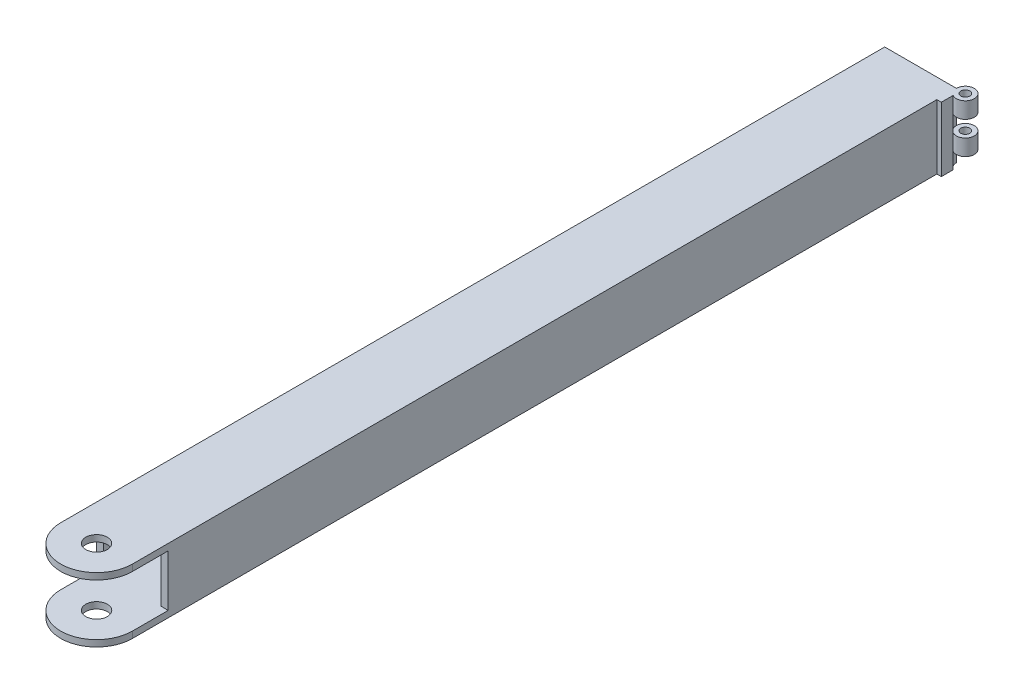
ISO-10303-21;
HEADER;
FILE_DESCRIPTION(('STEP AP214'),'2;1');
FILE_NAME('part.step','',(''),(''),'','','');
FILE_SCHEMA(('AUTOMOTIVE_DESIGN { 1 0 10303 214 1 1 1 1 }'));
ENDSEC;
DATA;
#1=APPLICATION_CONTEXT('core data for automotive mechanical design processes');
#2=APPLICATION_PROTOCOL_DEFINITION('international standard','automotive_design',2000,#1);
#3=PRODUCT_CONTEXT('',#1,'mechanical');
#4=PRODUCT('Part','Part','',(#3));
#5=PRODUCT_RELATED_PRODUCT_CATEGORY('part','',(#4));
#6=PRODUCT_DEFINITION_FORMATION('','',#4);
#7=PRODUCT_DEFINITION_CONTEXT('part definition',#1,'design');
#8=PRODUCT_DEFINITION('design','',#6,#7);
#9=PRODUCT_DEFINITION_SHAPE('','',#8);
#10=(LENGTH_UNIT() NAMED_UNIT(*) SI_UNIT(.MILLI.,.METRE.));
#11=(NAMED_UNIT(*) PLANE_ANGLE_UNIT() SI_UNIT($,.RADIAN.));
#12=(NAMED_UNIT(*) SI_UNIT($,.STERADIAN.) SOLID_ANGLE_UNIT());
#13=UNCERTAINTY_MEASURE_WITH_UNIT(LENGTH_MEASURE(1.E-05),#10,'distance_accuracy_value','');
#14=(GEOMETRIC_REPRESENTATION_CONTEXT(3) GLOBAL_UNCERTAINTY_ASSIGNED_CONTEXT((#13)) GLOBAL_UNIT_ASSIGNED_CONTEXT((#10,
#11,#12)) REPRESENTATION_CONTEXT('',''));
#15=CARTESIAN_POINT('',(0.,0.,0.));
#16=DIRECTION('',(0.,0.,1.));
#17=DIRECTION('',(1.,0.,0.));
#18=AXIS2_PLACEMENT_3D('',#15,#16,#17);
#19=CARTESIAN_POINT('',(25.,18.,0.));
#20=DIRECTION('',(0.,-1.,0.));
#21=DIRECTION('',(0.,0.,-1.));
#22=AXIS2_PLACEMENT_3D('',#19,#20,#21);
#23=CYLINDRICAL_SURFACE('',#22,5.);
#24=DIRECTION('',(0.,1.,0.));
#25=VECTOR('',#24,1.);
#26=CARTESIAN_POINT('',(20.,18.,0.));
#27=LINE('',#26,#25);
#28=CARTESIAN_POINT('',(20.,-9.,0.));
#29=VERTEX_POINT('',#28);
#30=CARTESIAN_POINT('',(20.,0.,0.));
#31=VERTEX_POINT('',#30);
#32=EDGE_CURVE('E209',#29,#31,#27,.T.);
#33=ORIENTED_EDGE('',*,*,#32,.T.);
#34=CARTESIAN_POINT('',(25.,0.,0.));
#35=DIRECTION('',(0.,1.,0.));
#36=DIRECTION('',(0.,0.,1.));
#37=AXIS2_PLACEMENT_3D('',#34,#35,#36);
#38=CIRCLE('',#37,5.);
#39=CARTESIAN_POINT('',(22.5,0.,4.3301270189222));
#40=VERTEX_POINT('',#39);
#41=EDGE_CURVE('E191',#40,#31,#38,.T.);
#42=ORIENTED_EDGE('',*,*,#41,.F.);
#43=DIRECTION('',(0.,-1.,0.));
#44=VECTOR('',#43,1.);
#45=CARTESIAN_POINT('',(22.5,18.,4.33012701892219));
#46=LINE('',#45,#44);
#47=CARTESIAN_POINT('',(22.5,-9.,4.33012701892219));
#48=VERTEX_POINT('',#47);
#49=EDGE_CURVE('E70',#40,#48,#46,.T.);
#50=ORIENTED_EDGE('',*,*,#49,.T.);
#51=CARTESIAN_POINT('',(25.,-9.,0.));
#52=DIRECTION('',(0.,-1.,0.));
#53=DIRECTION('',(0.,0.,-1.));
#54=AXIS2_PLACEMENT_3D('',#51,#52,#53);
#55=CIRCLE('',#54,5.);
#56=EDGE_CURVE('E181',#29,#48,#55,.T.);
#57=ORIENTED_EDGE('',*,*,#56,.F.);
#58=EDGE_LOOP('',(#33,#42,#50,#57));
#59=FACE_BOUND('',#58,.T.);
#60=ADVANCED_FACE('F43',(#59),#23,.T.);
#61=CARTESIAN_POINT('',(25.,18.,0.));
#62=DIRECTION('',(0.,-1.,0.));
#63=DIRECTION('',(0.,0.,-1.));
#64=AXIS2_PLACEMENT_3D('',#61,#62,#63);
#65=CYLINDRICAL_SURFACE('',#64,2.5);
#66=CARTESIAN_POINT('',(25.,-9.,0.));
#67=DIRECTION('',(0.,-1.,0.));
#68=DIRECTION('',(0.,0.,-1.));
#69=AXIS2_PLACEMENT_3D('',#66,#67,#68);
#70=CIRCLE('',#69,2.5);
#71=CARTESIAN_POINT('',(25.,-9.,-2.5));
#72=VERTEX_POINT('',#71);
#73=EDGE_CURVE('E48',#72,#72,#70,.F.);
#74=ORIENTED_EDGE('',*,*,#73,.F.);
#75=EDGE_LOOP('',(#74));
#76=FACE_BOUND('',#75,.T.);
#77=CARTESIAN_POINT('',(25.,0.,0.));
#78=DIRECTION('',(0.,1.,0.));
#79=DIRECTION('',(0.,0.,1.));
#80=AXIS2_PLACEMENT_3D('',#77,#78,#79);
#81=CIRCLE('',#80,2.5);
#82=CARTESIAN_POINT('',(25.,0.,2.5));
#83=VERTEX_POINT('',#82);
#84=EDGE_CURVE('E182',#83,#83,#81,.F.);
#85=ORIENTED_EDGE('',*,*,#84,.F.);
#86=EDGE_LOOP('',(#85));
#87=FACE_BOUND('',#86,.T.);
#88=ADVANCED_FACE('F480',(#76,#87),#65,.F.);
#89=CARTESIAN_POINT('',(-20.,-18.,480.));
#90=DIRECTION('',(0.,1.,0.));
#91=DIRECTION('',(0.,0.,1.));
#92=AXIS2_PLACEMENT_3D('',#89,#90,#91);
#93=PLANE('',#92);
#94=CARTESIAN_POINT('',(0.,-18.,460.));
#95=DIRECTION('',(0.,1.,0.));
#96=DIRECTION('',(0.,0.,1.));
#97=AXIS2_PLACEMENT_3D('',#94,#95,#96);
#98=CIRCLE('',#97,6.00000000000001);
#99=CARTESIAN_POINT('',(0.,-18.,466.));
#100=VERTEX_POINT('',#99);
#101=EDGE_CURVE('E273',#100,#100,#98,.T.);
#102=ORIENTED_EDGE('',*,*,#101,.T.);
#103=EDGE_LOOP('',(#102));
#104=FACE_BOUND('',#103,.T.);
#105=CARTESIAN_POINT('',(25.,-18.,0.));
#106=DIRECTION('',(0.,-1.,0.));
#107=DIRECTION('',(0.,0.,-1.));
#108=AXIS2_PLACEMENT_3D('',#105,#106,#107);
#109=CIRCLE('',#108,5.);
#110=CARTESIAN_POINT('',(22.5,-18.,4.33012701892219));
#111=VERTEX_POINT('',#110);
#112=CARTESIAN_POINT('',(20.,-18.,0.));
#113=VERTEX_POINT('',#112);
#114=EDGE_CURVE('E446',#111,#113,#109,.T.);
#115=ORIENTED_EDGE('',*,*,#114,.F.);
#116=DIRECTION('',(0.,0.,1.));
#117=VECTOR('',#116,1.);
#118=CARTESIAN_POINT('',(22.5,-18.,10.8981294611448));
#119=LINE('',#118,#117);
#120=CARTESIAN_POINT('',(22.5,-18.,10.8981294611448));
#121=VERTEX_POINT('',#120);
#122=EDGE_CURVE('E411',#111,#121,#119,.T.);
#123=ORIENTED_EDGE('',*,*,#122,.T.);
#124=DIRECTION('',(-1.,0.,0.));
#125=VECTOR('',#124,1.);
#126=CARTESIAN_POINT('',(20.,-18.,10.8981294611448));
#127=LINE('',#126,#125);
#128=CARTESIAN_POINT('',(20.,-18.,10.8981294611448));
#129=VERTEX_POINT('',#128);
#130=EDGE_CURVE('E409',#121,#129,#127,.T.);
#131=ORIENTED_EDGE('',*,*,#130,.T.);
#132=DIRECTION('',(0.,0.,-1.));
#133=VECTOR('',#132,1.);
#134=CARTESIAN_POINT('',(20.,-18.,480.));
#135=LINE('',#134,#133);
#136=CARTESIAN_POINT('',(20.,-18.,460.));
#137=VERTEX_POINT('',#136);
#138=EDGE_CURVE('E233',#137,#129,#135,.T.);
#139=ORIENTED_EDGE('',*,*,#138,.F.);
#140=CARTESIAN_POINT('',(0.,-18.,460.));
#141=DIRECTION('',(0.,1.,0.));
#142=DIRECTION('',(0.,0.,1.));
#143=AXIS2_PLACEMENT_3D('',#140,#141,#142);
#144=CIRCLE('',#143,20.);
#145=CARTESIAN_POINT('',(-20.,-18.,460.));
#146=VERTEX_POINT('',#145);
#147=EDGE_CURVE('E254',#137,#146,#144,.F.);
#148=ORIENTED_EDGE('',*,*,#147,.T.);
#149=DIRECTION('',(0.,0.,-1.));
#150=VECTOR('',#149,1.);
#151=CARTESIAN_POINT('',(-20.,-18.,480.));
#152=LINE('',#151,#150);
#153=CARTESIAN_POINT('',(-20.,-18.,0.));
#154=VERTEX_POINT('',#153);
#155=EDGE_CURVE('E236',#146,#154,#152,.T.);
#156=ORIENTED_EDGE('',*,*,#155,.T.);
#157=DIRECTION('',(1.,0.,0.));
#158=VECTOR('',#157,1.);
#159=CARTESIAN_POINT('',(-20.,-18.,0.));
#160=LINE('',#159,#158);
#161=EDGE_CURVE('E227',#154,#113,#160,.T.);
#162=ORIENTED_EDGE('',*,*,#161,.T.);
#163=EDGE_LOOP('',(#115,#123,#131,#139,#148,#156,#162));
#164=FACE_BOUND('',#163,.T.);
#165=ADVANCED_FACE('F406',(#104,#164),#93,.F.);
#166=CARTESIAN_POINT('',(25.,9.,0.));
#167=DIRECTION('',(0.,1.,0.));
#168=DIRECTION('',(0.,0.,1.));
#169=AXIS2_PLACEMENT_3D('',#166,#167,#168);
#170=CIRCLE('',#169,5.);
#171=CARTESIAN_POINT('',(22.5,9.,4.33012701892219));
#172=VERTEX_POINT('',#171);
#173=CARTESIAN_POINT('',(20.,9.,0.));
#174=VERTEX_POINT('',#173);
#175=EDGE_CURVE('E188',#172,#174,#170,.T.);
#176=ORIENTED_EDGE('',*,*,#175,.T.);
#177=CARTESIAN_POINT('',(20.,18.,0.));
#178=VERTEX_POINT('',#177);
#179=EDGE_CURVE('E197',#174,#178,#27,.T.);
#180=ORIENTED_EDGE('',*,*,#179,.T.);
#181=CARTESIAN_POINT('',(25.,18.,0.));
#182=DIRECTION('',(0.,-1.,0.));
#183=DIRECTION('',(0.,0.,-1.));
#184=AXIS2_PLACEMENT_3D('',#181,#182,#183);
#185=CIRCLE('',#184,5.);
#186=CARTESIAN_POINT('',(22.5,18.,4.33012701892219));
#187=VERTEX_POINT('',#186);
#188=EDGE_CURVE('E414',#178,#187,#185,.T.);
#189=ORIENTED_EDGE('',*,*,#188,.T.);
#190=EDGE_CURVE('E199',#187,#172,#46,.T.);
#191=ORIENTED_EDGE('',*,*,#190,.T.);
#192=EDGE_LOOP('',(#176,#180,#189,#191));
#193=FACE_BOUND('',#192,.T.);
#194=ADVANCED_FACE('F195',(#193),#23,.T.);
#195=CARTESIAN_POINT('',(25.,9.,0.));
#196=DIRECTION('',(0.,1.,0.));
#197=DIRECTION('',(0.,0.,1.));
#198=AXIS2_PLACEMENT_3D('',#195,#196,#197);
#199=CIRCLE('',#198,2.5);
#200=CARTESIAN_POINT('',(25.,9.,2.5));
#201=VERTEX_POINT('',#200);
#202=EDGE_CURVE('E452',#201,#201,#199,.F.);
#203=ORIENTED_EDGE('',*,*,#202,.T.);
#204=EDGE_LOOP('',(#203));
#205=FACE_BOUND('',#204,.T.);
#206=CARTESIAN_POINT('',(25.,18.,0.));
#207=DIRECTION('',(0.,-1.,0.));
#208=DIRECTION('',(0.,0.,-1.));
#209=AXIS2_PLACEMENT_3D('',#206,#207,#208);
#210=CIRCLE('',#209,2.5);
#211=CARTESIAN_POINT('',(25.,18.,-2.5));
#212=VERTEX_POINT('',#211);
#213=EDGE_CURVE('E420',#212,#212,#210,.T.);
#214=ORIENTED_EDGE('',*,*,#213,.F.);
#215=EDGE_LOOP('',(#214));
#216=FACE_BOUND('',#215,.T.);
#217=ADVANCED_FACE('F487',(#205,#216),#65,.F.);
#218=CARTESIAN_POINT('',(0.,14.4,460.));
#219=DIRECTION('',(0.,-1.,0.));
#220=DIRECTION('',(1.,0.,0.));
#221=AXIS2_PLACEMENT_3D('',#218,#219,#220);
#222=CYLINDRICAL_SURFACE('',#221,20.);
#223=DIRECTION('',(0.,1.,0.));
#224=VECTOR('',#223,1.);
#225=CARTESIAN_POINT('',(-20.,14.4,460.));
#226=LINE('',#225,#224);
#227=CARTESIAN_POINT('',(-20.,14.4,460.));
#228=VERTEX_POINT('',#227);
#229=CARTESIAN_POINT('',(-20.,18.,460.));
#230=VERTEX_POINT('',#229);
#231=EDGE_CURVE('E260',#228,#230,#226,.T.);
#232=ORIENTED_EDGE('',*,*,#231,.F.);
#233=CARTESIAN_POINT('',(0.,14.4,460.));
#234=DIRECTION('',(0.,-1.,0.));
#235=DIRECTION('',(0.,0.,-1.));
#236=AXIS2_PLACEMENT_3D('',#233,#234,#235);
#237=CIRCLE('',#236,20.);
#238=CARTESIAN_POINT('',(20.,14.4,460.));
#239=VERTEX_POINT('',#238);
#240=EDGE_CURVE('E54',#239,#228,#237,.T.);
#241=ORIENTED_EDGE('',*,*,#240,.F.);
#242=DIRECTION('',(0.,1.,0.));
#243=VECTOR('',#242,1.);
#244=CARTESIAN_POINT('',(20.,14.4,460.));
#245=LINE('',#244,#243);
#246=CARTESIAN_POINT('',(20.,18.,460.));
#247=VERTEX_POINT('',#246);
#248=EDGE_CURVE('E264',#247,#239,#245,.F.);
#249=ORIENTED_EDGE('',*,*,#248,.F.);
#250=CARTESIAN_POINT('',(0.,18.,460.));
#251=DIRECTION('',(0.,-1.,0.));
#252=DIRECTION('',(0.,0.,-1.));
#253=AXIS2_PLACEMENT_3D('',#250,#251,#252);
#254=CIRCLE('',#253,20.);
#255=EDGE_CURVE('E11',#230,#247,#254,.F.);
#256=ORIENTED_EDGE('',*,*,#255,.F.);
#257=EDGE_LOOP('',(#232,#241,#249,#256));
#258=FACE_BOUND('',#257,.T.);
#259=ADVANCED_FACE('F46',(#258),#222,.T.);
#260=CARTESIAN_POINT('',(0.,-18.,460.));
#261=DIRECTION('',(0.,-1.,0.));
#262=DIRECTION('',(1.,0.,0.));
#263=AXIS2_PLACEMENT_3D('',#260,#261,#262);
#264=CYLINDRICAL_SURFACE('',#263,20.);
#265=DIRECTION('',(0.,1.,0.));
#266=VECTOR('',#265,1.);
#267=CARTESIAN_POINT('',(-20.,-18.,460.));
#268=LINE('',#267,#266);
#269=CARTESIAN_POINT('',(-20.,-14.4,460.));
#270=VERTEX_POINT('',#269);
#271=EDGE_CURVE('E246',#146,#270,#268,.T.);
#272=ORIENTED_EDGE('',*,*,#271,.F.);
#273=ORIENTED_EDGE('',*,*,#147,.F.);
#274=DIRECTION('',(0.,1.,0.));
#275=VECTOR('',#274,1.);
#276=CARTESIAN_POINT('',(20.,-18.,460.));
#277=LINE('',#276,#275);
#278=CARTESIAN_POINT('',(20.,-14.4,460.));
#279=VERTEX_POINT('',#278);
#280=EDGE_CURVE('E250',#279,#137,#277,.F.);
#281=ORIENTED_EDGE('',*,*,#280,.F.);
#282=CARTESIAN_POINT('',(0.,-14.4,460.));
#283=DIRECTION('',(0.,1.,0.));
#284=DIRECTION('',(-1.,0.,0.));
#285=AXIS2_PLACEMENT_3D('',#282,#283,#284);
#286=CIRCLE('',#285,20.);
#287=EDGE_CURVE('E257',#270,#279,#286,.T.);
#288=ORIENTED_EDGE('',*,*,#287,.F.);
#289=EDGE_LOOP('',(#272,#273,#281,#288));
#290=FACE_BOUND('',#289,.T.);
#291=ADVANCED_FACE('F401',(#290),#264,.T.);
#292=CARTESIAN_POINT('',(0.,0.,0.));
#293=DIRECTION('',(0.,0.,1.));
#294=DIRECTION('',(1.,0.,0.));
#295=AXIS2_PLACEMENT_3D('',#292,#293,#294);
#296=PLANE('',#295);
#297=EDGE_CURVE('E212',#113,#29,#27,.T.);
#298=ORIENTED_EDGE('',*,*,#297,.F.);
#299=ORIENTED_EDGE('',*,*,#161,.F.);
#300=DIRECTION('',(0.,-1.,0.));
#301=VECTOR('',#300,1.);
#302=CARTESIAN_POINT('',(-20.,18.,0.));
#303=LINE('',#302,#301);
#304=CARTESIAN_POINT('',(-20.,18.,0.));
#305=VERTEX_POINT('',#304);
#306=EDGE_CURVE('E222',#305,#154,#303,.T.);
#307=ORIENTED_EDGE('',*,*,#306,.F.);
#308=DIRECTION('',(-1.,0.,0.));
#309=VECTOR('',#308,1.);
#310=CARTESIAN_POINT('',(-20.,18.,0.));
#311=LINE('',#310,#309);
#312=EDGE_CURVE('E206',#178,#305,#311,.T.);
#313=ORIENTED_EDGE('',*,*,#312,.F.);
#314=ORIENTED_EDGE('',*,*,#179,.F.);
#315=DIRECTION('',(0.,1.,0.));
#316=VECTOR('',#315,1.);
#317=CARTESIAN_POINT('',(20.,0.,0.));
#318=LINE('',#317,#316);
#319=EDGE_CURVE('E172',#174,#31,#318,.F.);
#320=ORIENTED_EDGE('',*,*,#319,.T.);
#321=ORIENTED_EDGE('',*,*,#32,.F.);
#322=EDGE_LOOP('',(#298,#299,#307,#313,#314,#320,#321));
#323=FACE_BOUND('',#322,.T.);
#324=DIRECTION('',(0.,1.,0.));
#325=VECTOR('',#324,1.);
#326=CARTESIAN_POINT('',(16.,14.4,0.));
#327=LINE('',#326,#325);
#328=CARTESIAN_POINT('',(16.,-14.4,0.));
#329=VERTEX_POINT('',#328);
#330=CARTESIAN_POINT('',(16.,14.4,0.));
#331=VERTEX_POINT('',#330);
#332=EDGE_CURVE('E334',#329,#331,#327,.T.);
#333=ORIENTED_EDGE('',*,*,#332,.T.);
#334=DIRECTION('',(-1.,0.,0.));
#335=VECTOR('',#334,1.);
#336=CARTESIAN_POINT('',(-16.,14.4,0.));
#337=LINE('',#336,#335);
#338=CARTESIAN_POINT('',(-16.,14.4,0.));
#339=VERTEX_POINT('',#338);
#340=EDGE_CURVE('E338',#331,#339,#337,.T.);
#341=ORIENTED_EDGE('',*,*,#340,.T.);
#342=DIRECTION('',(0.,-1.,0.));
#343=VECTOR('',#342,1.);
#344=CARTESIAN_POINT('',(-16.,14.4,0.));
#345=LINE('',#344,#343);
#346=CARTESIAN_POINT('',(-16.,-14.4,0.));
#347=VERTEX_POINT('',#346);
#348=EDGE_CURVE('E342',#339,#347,#345,.T.);
#349=ORIENTED_EDGE('',*,*,#348,.T.);
#350=DIRECTION('',(1.,0.,0.));
#351=VECTOR('',#350,1.);
#352=CARTESIAN_POINT('',(-16.,-14.4,0.));
#353=LINE('',#352,#351);
#354=EDGE_CURVE('E346',#347,#329,#353,.T.);
#355=ORIENTED_EDGE('',*,*,#354,.T.);
#356=EDGE_LOOP('',(#333,#341,#349,#355));
#357=FACE_BOUND('',#356,.T.);
#358=ADVANCED_FACE('F202',(#323,#357),#296,.F.);
#359=CARTESIAN_POINT('',(20.,18.,480.));
#360=DIRECTION('',(-1.,0.,0.));
#361=DIRECTION('',(0.,-1.,0.));
#362=AXIS2_PLACEMENT_3D('',#359,#360,#361);
#363=PLANE('',#362);
#364=ORIENTED_EDGE('',*,*,#138,.T.);
#365=DIRECTION('',(0.,-1.,0.));
#366=VECTOR('',#365,1.);
#367=CARTESIAN_POINT('',(20.,18.,10.8981294611448));
#368=LINE('',#367,#366);
#369=CARTESIAN_POINT('',(20.,18.,10.8981294611448));
#370=VERTEX_POINT('',#369);
#371=EDGE_CURVE('E282',#370,#129,#368,.T.);
#372=ORIENTED_EDGE('',*,*,#371,.F.);
#373=DIRECTION('',(0.,0.,-1.));
#374=VECTOR('',#373,1.);
#375=CARTESIAN_POINT('',(20.,18.,480.));
#376=LINE('',#375,#374);
#377=EDGE_CURVE('E242',#247,#370,#376,.T.);
#378=ORIENTED_EDGE('',*,*,#377,.F.);
#379=ORIENTED_EDGE('',*,*,#248,.T.);
#380=DIRECTION('',(0.,0.,-1.));
#381=VECTOR('',#380,1.);
#382=CARTESIAN_POINT('',(20.,14.4,480.));
#383=LINE('',#382,#381);
#384=CARTESIAN_POINT('',(20.,14.4,440.));
#385=VERTEX_POINT('',#384);
#386=EDGE_CURVE('E324',#239,#385,#383,.T.);
#387=ORIENTED_EDGE('',*,*,#386,.T.);
#388=DIRECTION('',(0.,-1.,0.));
#389=VECTOR('',#388,1.);
#390=CARTESIAN_POINT('',(20.,18.,440.));
#391=LINE('',#390,#389);
#392=CARTESIAN_POINT('',(20.,-14.4,440.));
#393=VERTEX_POINT('',#392);
#394=EDGE_CURVE('E316',#385,#393,#391,.T.);
#395=ORIENTED_EDGE('',*,*,#394,.T.);
#396=DIRECTION('',(0.,0.,1.));
#397=VECTOR('',#396,1.);
#398=CARTESIAN_POINT('',(20.,-14.4,480.));
#399=LINE('',#398,#397);
#400=EDGE_CURVE('E330',#393,#279,#399,.T.);
#401=ORIENTED_EDGE('',*,*,#400,.T.);
#402=ORIENTED_EDGE('',*,*,#280,.T.);
#403=EDGE_LOOP('',(#364,#372,#378,#379,#387,#395,#401,#402));
#404=FACE_BOUND('',#403,.T.);
#405=ADVANCED_FACE('F390',(#404),#363,.F.);
#406=CARTESIAN_POINT('',(-20.,18.,480.));
#407=DIRECTION('',(0.,-1.,0.));
#408=DIRECTION('',(0.,0.,-1.));
#409=AXIS2_PLACEMENT_3D('',#406,#407,#408);
#410=PLANE('',#409);
#411=CARTESIAN_POINT('',(0.,18.,460.));
#412=DIRECTION('',(0.,-1.,0.));
#413=DIRECTION('',(0.,0.,-1.));
#414=AXIS2_PLACEMENT_3D('',#411,#412,#413);
#415=CIRCLE('',#414,6.00000000000001);
#416=CARTESIAN_POINT('',(0.,18.,454.));
#417=VERTEX_POINT('',#416);
#418=EDGE_CURVE('E279',#417,#417,#415,.T.);
#419=ORIENTED_EDGE('',*,*,#418,.T.);
#420=EDGE_LOOP('',(#419));
#421=FACE_BOUND('',#420,.T.);
#422=DIRECTION('',(0.,0.,-1.));
#423=VECTOR('',#422,1.);
#424=CARTESIAN_POINT('',(-20.,18.,480.));
#425=LINE('',#424,#423);
#426=EDGE_CURVE('E239',#230,#305,#425,.T.);
#427=ORIENTED_EDGE('',*,*,#426,.F.);
#428=ORIENTED_EDGE('',*,*,#255,.T.);
#429=ORIENTED_EDGE('',*,*,#377,.T.);
#430=DIRECTION('',(-1.,0.,0.));
#431=VECTOR('',#430,1.);
#432=CARTESIAN_POINT('',(20.,18.,10.8981294611448));
#433=LINE('',#432,#431);
#434=CARTESIAN_POINT('',(22.5,18.,10.8981294611448));
#435=VERTEX_POINT('',#434);
#436=EDGE_CURVE('E432',#435,#370,#433,.T.);
#437=ORIENTED_EDGE('',*,*,#436,.F.);
#438=DIRECTION('',(0.,0.,1.));
#439=VECTOR('',#438,1.);
#440=CARTESIAN_POINT('',(22.5,18.,10.8981294611448));
#441=LINE('',#440,#439);
#442=EDGE_CURVE('E418',#187,#435,#441,.T.);
#443=ORIENTED_EDGE('',*,*,#442,.F.);
#444=ORIENTED_EDGE('',*,*,#188,.F.);
#445=ORIENTED_EDGE('',*,*,#312,.T.);
#446=EDGE_LOOP('',(#427,#428,#429,#437,#443,#444,#445));
#447=FACE_BOUND('',#446,.T.);
#448=ORIENTED_EDGE('',*,*,#213,.T.);
#449=EDGE_LOOP('',(#448));
#450=FACE_BOUND('',#449,.T.);
#451=ADVANCED_FACE('F463',(#421,#447,#450),#410,.F.);
#452=CARTESIAN_POINT('',(-20.,18.,480.));
#453=DIRECTION('',(1.,0.,0.));
#454=DIRECTION('',(0.,1.,0.));
#455=AXIS2_PLACEMENT_3D('',#452,#453,#454);
#456=PLANE('',#455);
#457=DIRECTION('',(0.,0.,1.));
#458=VECTOR('',#457,1.);
#459=CARTESIAN_POINT('',(-20.,14.4,480.));
#460=LINE('',#459,#458);
#461=CARTESIAN_POINT('',(-20.,14.4,440.));
#462=VERTEX_POINT('',#461);
#463=EDGE_CURVE('E320',#462,#228,#460,.T.);
#464=ORIENTED_EDGE('',*,*,#463,.T.);
#465=ORIENTED_EDGE('',*,*,#231,.T.);
#466=ORIENTED_EDGE('',*,*,#426,.T.);
#467=ORIENTED_EDGE('',*,*,#306,.T.);
#468=ORIENTED_EDGE('',*,*,#155,.F.);
#469=ORIENTED_EDGE('',*,*,#271,.T.);
#470=DIRECTION('',(0.,0.,-1.));
#471=VECTOR('',#470,1.);
#472=CARTESIAN_POINT('',(-20.,-14.4,480.));
#473=LINE('',#472,#471);
#474=CARTESIAN_POINT('',(-20.,-14.4,440.));
#475=VERTEX_POINT('',#474);
#476=EDGE_CURVE('E327',#270,#475,#473,.T.);
#477=ORIENTED_EDGE('',*,*,#476,.T.);
#478=DIRECTION('',(0.,1.,0.));
#479=VECTOR('',#478,1.);
#480=CARTESIAN_POINT('',(-20.,18.,440.));
#481=LINE('',#480,#479);
#482=EDGE_CURVE('E312',#475,#462,#481,.T.);
#483=ORIENTED_EDGE('',*,*,#482,.T.);
#484=EDGE_LOOP('',(#464,#465,#466,#467,#468,#469,#477,#483));
#485=FACE_BOUND('',#484,.T.);
#486=ADVANCED_FACE('F396',(#485),#456,.F.);
#487=CARTESIAN_POINT('',(16.,14.4,480.));
#488=DIRECTION('',(-1.,0.,0.));
#489=DIRECTION('',(0.,-1.,0.));
#490=AXIS2_PLACEMENT_3D('',#487,#488,#489);
#491=PLANE('',#490);
#492=DIRECTION('',(0.,-1.,0.));
#493=VECTOR('',#492,1.);
#494=CARTESIAN_POINT('',(16.,14.4,440.));
#495=LINE('',#494,#493);
#496=CARTESIAN_POINT('',(16.,14.4,440.));
#497=VERTEX_POINT('',#496);
#498=CARTESIAN_POINT('',(16.,-14.4,440.));
#499=VERTEX_POINT('',#498);
#500=EDGE_CURVE('E309',#497,#499,#495,.T.);
#501=ORIENTED_EDGE('',*,*,#500,.F.);
#502=DIRECTION('',(0.,0.,-1.));
#503=VECTOR('',#502,1.);
#504=CARTESIAN_POINT('',(16.,14.4,480.));
#505=LINE('',#504,#503);
#506=EDGE_CURVE('E210',#497,#331,#505,.T.);
#507=ORIENTED_EDGE('',*,*,#506,.T.);
#508=ORIENTED_EDGE('',*,*,#332,.F.);
#509=DIRECTION('',(0.,0.,-1.));
#510=VECTOR('',#509,1.);
#511=CARTESIAN_POINT('',(16.,-14.4,480.));
#512=LINE('',#511,#510);
#513=EDGE_CURVE('E350',#499,#329,#512,.T.);
#514=ORIENTED_EDGE('',*,*,#513,.F.);
#515=EDGE_LOOP('',(#501,#507,#508,#514));
#516=FACE_BOUND('',#515,.T.);
#517=ADVANCED_FACE('F374',(#516),#491,.T.);
#518=CARTESIAN_POINT('',(-16.,14.4,480.));
#519=DIRECTION('',(0.,-1.,0.));
#520=DIRECTION('',(0.,0.,-1.));
#521=AXIS2_PLACEMENT_3D('',#518,#519,#520);
#522=PLANE('',#521);
#523=CARTESIAN_POINT('',(0.,14.4,460.));
#524=DIRECTION('',(0.,-1.,0.));
#525=DIRECTION('',(0.,0.,-1.));
#526=AXIS2_PLACEMENT_3D('',#523,#524,#525);
#527=CIRCLE('',#526,6.00000000000001);
#528=CARTESIAN_POINT('',(0.,14.4,454.));
#529=VERTEX_POINT('',#528);
#530=EDGE_CURVE('E272',#529,#529,#527,.T.);
#531=ORIENTED_EDGE('',*,*,#530,.F.);
#532=EDGE_LOOP('',(#531));
#533=FACE_BOUND('',#532,.T.);
#534=ORIENTED_EDGE('',*,*,#386,.F.);
#535=ORIENTED_EDGE('',*,*,#240,.T.);
#536=ORIENTED_EDGE('',*,*,#463,.F.);
#537=DIRECTION('',(-1.,0.,0.));
#538=VECTOR('',#537,1.);
#539=CARTESIAN_POINT('',(-25.,14.4,440.));
#540=LINE('',#539,#538);
#541=CARTESIAN_POINT('',(-16.,14.4,440.));
#542=VERTEX_POINT('',#541);
#543=EDGE_CURVE('E296',#542,#462,#540,.T.);
#544=ORIENTED_EDGE('',*,*,#543,.F.);
#545=DIRECTION('',(0.,0.,-1.));
#546=VECTOR('',#545,1.);
#547=CARTESIAN_POINT('',(-16.,14.4,480.));
#548=LINE('',#547,#546);
#549=EDGE_CURVE('E215',#542,#339,#548,.T.);
#550=ORIENTED_EDGE('',*,*,#549,.T.);
#551=ORIENTED_EDGE('',*,*,#340,.F.);
#552=ORIENTED_EDGE('',*,*,#506,.F.);
#553=EDGE_CURVE('E300',#385,#497,#540,.T.);
#554=ORIENTED_EDGE('',*,*,#553,.F.);
#555=EDGE_LOOP('',(#534,#535,#536,#544,#550,#551,#552,#554));
#556=FACE_BOUND('',#555,.T.);
#557=ADVANCED_FACE('F363',(#533,#556),#522,.T.);
#558=CARTESIAN_POINT('',(-16.,14.4,480.));
#559=DIRECTION('',(1.,0.,0.));
#560=DIRECTION('',(0.,1.,0.));
#561=AXIS2_PLACEMENT_3D('',#558,#559,#560);
#562=PLANE('',#561);
#563=DIRECTION('',(0.,1.,0.));
#564=VECTOR('',#563,1.);
#565=CARTESIAN_POINT('',(-16.,14.4,440.));
#566=LINE('',#565,#564);
#567=CARTESIAN_POINT('',(-16.,-14.4,440.));
#568=VERTEX_POINT('',#567);
#569=EDGE_CURVE('E306',#568,#542,#566,.T.);
#570=ORIENTED_EDGE('',*,*,#569,.F.);
#571=DIRECTION('',(0.,0.,-1.));
#572=VECTOR('',#571,1.);
#573=CARTESIAN_POINT('',(-16.,-14.4,480.));
#574=LINE('',#573,#572);
#575=EDGE_CURVE('E353',#568,#347,#574,.T.);
#576=ORIENTED_EDGE('',*,*,#575,.T.);
#577=ORIENTED_EDGE('',*,*,#348,.F.);
#578=ORIENTED_EDGE('',*,*,#549,.F.);
#579=EDGE_LOOP('',(#570,#576,#577,#578));
#580=FACE_BOUND('',#579,.T.);
#581=ADVANCED_FACE('F367',(#580),#562,.T.);
#582=CARTESIAN_POINT('',(-16.,-14.4,480.));
#583=DIRECTION('',(0.,1.,0.));
#584=DIRECTION('',(-1.,0.,0.));
#585=AXIS2_PLACEMENT_3D('',#582,#583,#584);
#586=PLANE('',#585);
#587=CARTESIAN_POINT('',(0.,-14.4,460.));
#588=DIRECTION('',(0.,1.,0.));
#589=DIRECTION('',(-1.,0.,0.));
#590=AXIS2_PLACEMENT_3D('',#587,#588,#589);
#591=CIRCLE('',#590,6.00000000000001);
#592=CARTESIAN_POINT('',(-6.00000000000001,-14.4,460.));
#593=VERTEX_POINT('',#592);
#594=EDGE_CURVE('E269',#593,#593,#591,.T.);
#595=ORIENTED_EDGE('',*,*,#594,.F.);
#596=EDGE_LOOP('',(#595));
#597=FACE_BOUND('',#596,.T.);
#598=ORIENTED_EDGE('',*,*,#476,.F.);
#599=ORIENTED_EDGE('',*,*,#287,.T.);
#600=ORIENTED_EDGE('',*,*,#400,.F.);
#601=DIRECTION('',(1.,0.,0.));
#602=VECTOR('',#601,1.);
#603=CARTESIAN_POINT('',(-25.,-14.4,440.));
#604=LINE('',#603,#602);
#605=EDGE_CURVE('E301',#499,#393,#604,.T.);
#606=ORIENTED_EDGE('',*,*,#605,.F.);
#607=ORIENTED_EDGE('',*,*,#513,.T.);
#608=ORIENTED_EDGE('',*,*,#354,.F.);
#609=ORIENTED_EDGE('',*,*,#575,.F.);
#610=EDGE_CURVE('E305',#475,#568,#604,.T.);
#611=ORIENTED_EDGE('',*,*,#610,.F.);
#612=EDGE_LOOP('',(#598,#599,#600,#606,#607,#608,#609,#611));
#613=FACE_BOUND('',#612,.T.);
#614=ADVANCED_FACE('F386',(#597,#613),#586,.T.);
#615=CARTESIAN_POINT('',(0.,0.,440.));
#616=DIRECTION('',(0.,0.,-1.));
#617=DIRECTION('',(-1.,0.,0.));
#618=AXIS2_PLACEMENT_3D('',#615,#616,#617);
#619=PLANE('',#618);
#620=ORIENTED_EDGE('',*,*,#610,.T.);
#621=ORIENTED_EDGE('',*,*,#569,.T.);
#622=ORIENTED_EDGE('',*,*,#543,.T.);
#623=ORIENTED_EDGE('',*,*,#482,.F.);
#624=EDGE_LOOP('',(#620,#621,#622,#623));
#625=FACE_BOUND('',#624,.T.);
#626=ADVANCED_FACE('F383',(#625),#619,.F.);
#627=ORIENTED_EDGE('',*,*,#553,.T.);
#628=ORIENTED_EDGE('',*,*,#500,.T.);
#629=ORIENTED_EDGE('',*,*,#605,.T.);
#630=ORIENTED_EDGE('',*,*,#394,.F.);
#631=EDGE_LOOP('',(#627,#628,#629,#630));
#632=FACE_BOUND('',#631,.T.);
#633=ADVANCED_FACE('F388',(#632),#619,.F.);
#634=CARTESIAN_POINT('',(0.,-18.,460.));
#635=DIRECTION('',(0.,1.,0.));
#636=DIRECTION('',(0.,0.,1.));
#637=AXIS2_PLACEMENT_3D('',#634,#635,#636);
#638=CYLINDRICAL_SURFACE('',#637,6.00000000000001);
#639=ORIENTED_EDGE('',*,*,#594,.T.);
#640=EDGE_LOOP('',(#639));
#641=FACE_BOUND('',#640,.T.);
#642=ORIENTED_EDGE('',*,*,#101,.F.);
#643=EDGE_LOOP('',(#642));
#644=FACE_BOUND('',#643,.T.);
#645=ADVANCED_FACE('F560',(#641,#644),#638,.F.);
#646=ORIENTED_EDGE('',*,*,#530,.T.);
#647=EDGE_LOOP('',(#646));
#648=FACE_BOUND('',#647,.T.);
#649=ORIENTED_EDGE('',*,*,#418,.F.);
#650=EDGE_LOOP('',(#649));
#651=FACE_BOUND('',#650,.T.);
#652=ADVANCED_FACE('F564',(#648,#651),#638,.F.);
#653=CARTESIAN_POINT('',(20.,18.,10.8981294611448));
#654=DIRECTION('',(0.,0.,1.));
#655=DIRECTION('',(1.,0.,0.));
#656=AXIS2_PLACEMENT_3D('',#653,#654,#655);
#657=PLANE('',#656);
#658=ORIENTED_EDGE('',*,*,#130,.F.);
#659=DIRECTION('',(0.,-1.,0.));
#660=VECTOR('',#659,1.);
#661=CARTESIAN_POINT('',(22.5,18.,10.8981294611448));
#662=LINE('',#661,#660);
#663=EDGE_CURVE('E288',#435,#121,#662,.T.);
#664=ORIENTED_EDGE('',*,*,#663,.F.);
#665=ORIENTED_EDGE('',*,*,#436,.T.);
#666=ORIENTED_EDGE('',*,*,#371,.T.);
#667=EDGE_LOOP('',(#658,#664,#665,#666));
#668=FACE_BOUND('',#667,.T.);
#669=ADVANCED_FACE('F476',(#668),#657,.T.);
#670=CARTESIAN_POINT('',(22.5,18.,10.8981294611448));
#671=DIRECTION('',(1.,0.,0.));
#672=DIRECTION('',(0.,0.,-1.));
#673=AXIS2_PLACEMENT_3D('',#670,#671,#672);
#674=PLANE('',#673);
#675=ORIENTED_EDGE('',*,*,#122,.F.);
#676=EDGE_CURVE('E428',#48,#111,#46,.T.);
#677=ORIENTED_EDGE('',*,*,#676,.F.);
#678=ORIENTED_EDGE('',*,*,#49,.F.);
#679=EDGE_CURVE('E427',#172,#40,#46,.T.);
#680=ORIENTED_EDGE('',*,*,#679,.F.);
#681=ORIENTED_EDGE('',*,*,#190,.F.);
#682=ORIENTED_EDGE('',*,*,#442,.T.);
#683=ORIENTED_EDGE('',*,*,#663,.T.);
#684=EDGE_LOOP('',(#675,#677,#678,#680,#681,#682,#683));
#685=FACE_BOUND('',#684,.T.);
#686=ADVANCED_FACE('F461',(#685),#674,.T.);
#687=CARTESIAN_POINT('',(25.,-18.,0.));
#688=DIRECTION('',(0.,1.,0.));
#689=DIRECTION('',(0.,0.,1.));
#690=AXIS2_PLACEMENT_3D('',#687,#688,#689);
#691=CYLINDRICAL_SURFACE('',#690,5.);
#692=ORIENTED_EDGE('',*,*,#297,.T.);
#693=EDGE_CURVE('E443',#48,#29,#55,.T.);
#694=ORIENTED_EDGE('',*,*,#693,.F.);
#695=ORIENTED_EDGE('',*,*,#676,.T.);
#696=ORIENTED_EDGE('',*,*,#114,.T.);
#697=EDGE_LOOP('',(#692,#694,#695,#696));
#698=FACE_BOUND('',#697,.T.);
#699=ADVANCED_FACE('F466',(#698),#691,.F.);
#700=CARTESIAN_POINT('',(25.,-9.,0.));
#701=DIRECTION('',(0.,-1.,0.));
#702=DIRECTION('',(0.,0.,-1.));
#703=AXIS2_PLACEMENT_3D('',#700,#701,#702);
#704=PLANE('',#703);
#705=ORIENTED_EDGE('',*,*,#693,.T.);
#706=ORIENTED_EDGE('',*,*,#56,.T.);
#707=EDGE_LOOP('',(#705,#706));
#708=FACE_BOUND('',#707,.T.);
#709=ORIENTED_EDGE('',*,*,#73,.T.);
#710=EDGE_LOOP('',(#709));
#711=FACE_BOUND('',#710,.T.);
#712=ADVANCED_FACE('F468',(#708,#711),#704,.T.);
#713=CARTESIAN_POINT('',(25.,0.,0.));
#714=DIRECTION('',(0.,1.,0.));
#715=DIRECTION('',(0.,0.,1.));
#716=AXIS2_PLACEMENT_3D('',#713,#714,#715);
#717=CYLINDRICAL_SURFACE('',#716,5.);
#718=EDGE_CURVE('E62',#174,#172,#170,.T.);
#719=ORIENTED_EDGE('',*,*,#718,.T.);
#720=ORIENTED_EDGE('',*,*,#679,.T.);
#721=EDGE_CURVE('E175',#31,#40,#38,.T.);
#722=ORIENTED_EDGE('',*,*,#721,.F.);
#723=ORIENTED_EDGE('',*,*,#319,.F.);
#724=EDGE_LOOP('',(#719,#720,#722,#723));
#725=FACE_BOUND('',#724,.T.);
#726=ADVANCED_FACE('F173',(#725),#717,.F.);
#727=CARTESIAN_POINT('',(25.,0.,0.));
#728=DIRECTION('',(0.,1.,0.));
#729=DIRECTION('',(0.,0.,1.));
#730=AXIS2_PLACEMENT_3D('',#727,#728,#729);
#731=PLANE('',#730);
#732=ORIENTED_EDGE('',*,*,#721,.T.);
#733=ORIENTED_EDGE('',*,*,#41,.T.);
#734=EDGE_LOOP('',(#732,#733));
#735=FACE_BOUND('',#734,.T.);
#736=ORIENTED_EDGE('',*,*,#84,.T.);
#737=EDGE_LOOP('',(#736));
#738=FACE_BOUND('',#737,.T.);
#739=ADVANCED_FACE('F459',(#735,#738),#731,.T.);
#740=CARTESIAN_POINT('',(25.,9.,0.));
#741=DIRECTION('',(0.,1.,0.));
#742=DIRECTION('',(0.,0.,1.));
#743=AXIS2_PLACEMENT_3D('',#740,#741,#742);
#744=PLANE('',#743);
#745=ORIENTED_EDGE('',*,*,#718,.F.);
#746=ORIENTED_EDGE('',*,*,#175,.F.);
#747=EDGE_LOOP('',(#745,#746));
#748=FACE_BOUND('',#747,.T.);
#749=ORIENTED_EDGE('',*,*,#202,.F.);
#750=EDGE_LOOP('',(#749));
#751=FACE_BOUND('',#750,.T.);
#752=ADVANCED_FACE('F186',(#748,#751),#744,.F.);
#753=CLOSED_SHELL('',(#60,#88,#165,#194,#217,#259,#291,#358,#405,#451,#486,#517,#557,#581,#614,
#626,#633,#645,#652,#669,#686,#699,#712,#726,#739,#752));
#754=MANIFOLD_SOLID_BREP('B2',#753);
#755=ADVANCED_BREP_SHAPE_REPRESENTATION('',(#18,#754),#14);
#756=SHAPE_DEFINITION_REPRESENTATION(#9,#755);
ENDSEC;
END-ISO-10303-21;
